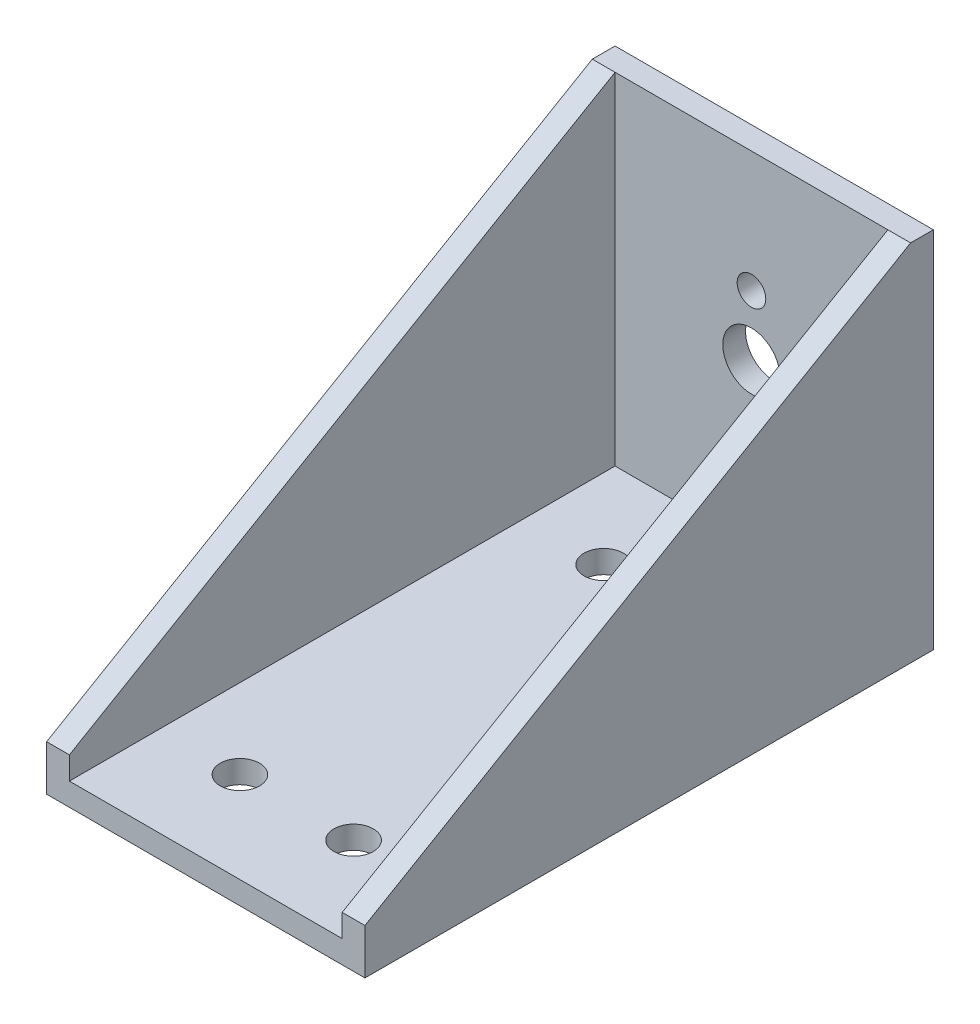
ISO-10303-21;
HEADER;
FILE_DESCRIPTION(('STEP AP214'),'2;1');
FILE_NAME('part.step','',(''),(''),'','','');
FILE_SCHEMA(('AUTOMOTIVE_DESIGN { 1 0 10303 214 1 1 1 1 }'));
ENDSEC;
DATA;
#1=APPLICATION_CONTEXT('core data for automotive mechanical design processes');
#2=APPLICATION_PROTOCOL_DEFINITION('international standard','automotive_design',2000,#1);
#3=PRODUCT_CONTEXT('',#1,'mechanical');
#4=PRODUCT('Part','Part','',(#3));
#5=PRODUCT_RELATED_PRODUCT_CATEGORY('part','',(#4));
#6=PRODUCT_DEFINITION_FORMATION('','',#4);
#7=PRODUCT_DEFINITION_CONTEXT('part definition',#1,'design');
#8=PRODUCT_DEFINITION('design','',#6,#7);
#9=PRODUCT_DEFINITION_SHAPE('','',#8);
#10=(LENGTH_UNIT() NAMED_UNIT(*) SI_UNIT(.MILLI.,.METRE.));
#11=(NAMED_UNIT(*) PLANE_ANGLE_UNIT() SI_UNIT($,.RADIAN.));
#12=(NAMED_UNIT(*) SI_UNIT($,.STERADIAN.) SOLID_ANGLE_UNIT());
#13=UNCERTAINTY_MEASURE_WITH_UNIT(LENGTH_MEASURE(1.E-05),#10,'distance_accuracy_value','');
#14=(GEOMETRIC_REPRESENTATION_CONTEXT(3) GLOBAL_UNCERTAINTY_ASSIGNED_CONTEXT((#13)) GLOBAL_UNIT_ASSIGNED_CONTEXT((#10,
#11,#12)) REPRESENTATION_CONTEXT('',''));
#15=CARTESIAN_POINT('',(0.,0.,0.));
#16=DIRECTION('',(0.,0.,1.));
#17=DIRECTION('',(1.,0.,0.));
#18=AXIS2_PLACEMENT_3D('',#15,#16,#17);
#19=CARTESIAN_POINT('',(0.,0.,3.175));
#20=DIRECTION('',(0.,0.,-1.));
#21=DIRECTION('',(-1.,0.,0.));
#22=AXIS2_PLACEMENT_3D('',#19,#20,#21);
#23=PLANE('',#22);
#24=CARTESIAN_POINT('',(0.,0.,3.175));
#25=DIRECTION('',(0.,0.,1.));
#26=DIRECTION('',(1.,0.,0.));
#27=AXIS2_PLACEMENT_3D('',#24,#25,#26);
#28=CIRCLE('',#27,4.);
#29=CARTESIAN_POINT('',(4.,0.,3.175));
#30=VERTEX_POINT('',#29);
#31=EDGE_CURVE('E210',#30,#30,#28,.T.);
#32=ORIENTED_EDGE('',*,*,#31,.F.);
#33=EDGE_LOOP('',(#32));
#34=FACE_BOUND('',#33,.T.);
#35=CARTESIAN_POINT('',(0.,-8.5,3.175));
#36=DIRECTION('',(0.,0.,1.));
#37=DIRECTION('',(-1.,0.,0.));
#38=AXIS2_PLACEMENT_3D('',#35,#36,#37);
#39=CIRCLE('',#38,2.);
#40=CARTESIAN_POINT('',(-2.,-8.5,3.175));
#41=VERTEX_POINT('',#40);
#42=EDGE_CURVE('E218',#41,#41,#39,.T.);
#43=ORIENTED_EDGE('',*,*,#42,.F.);
#44=EDGE_LOOP('',(#43));
#45=FACE_BOUND('',#44,.T.);
#46=CARTESIAN_POINT('',(0.,8.5,3.175));
#47=DIRECTION('',(0.,0.,1.));
#48=DIRECTION('',(1.,0.,0.));
#49=AXIS2_PLACEMENT_3D('',#46,#47,#48);
#50=CIRCLE('',#49,2.);
#51=CARTESIAN_POINT('',(2.,8.5,3.175));
#52=VERTEX_POINT('',#51);
#53=EDGE_CURVE('E226',#52,#52,#50,.T.);
#54=ORIENTED_EDGE('',*,*,#53,.F.);
#55=EDGE_LOOP('',(#54));
#56=FACE_BOUND('',#55,.T.);
#57=DIRECTION('',(0.,-1.,0.));
#58=VECTOR('',#57,1.);
#59=CARTESIAN_POINT('',(19.05,25.4,3.17499999999999));
#60=LINE('',#59,#58);
#61=CARTESIAN_POINT('',(19.05,25.4,3.17499999999999));
#62=VERTEX_POINT('',#61);
#63=CARTESIAN_POINT('',(19.05,-22.225,3.17499999999999));
#64=VERTEX_POINT('',#63);
#65=EDGE_CURVE('E115',#62,#64,#60,.T.);
#66=ORIENTED_EDGE('',*,*,#65,.F.);
#67=DIRECTION('',(-1.,0.,0.));
#68=VECTOR('',#67,1.);
#69=CARTESIAN_POINT('',(-22.225,25.4,3.175));
#70=LINE('',#69,#68);
#71=CARTESIAN_POINT('',(-19.05,25.4,3.175));
#72=VERTEX_POINT('',#71);
#73=EDGE_CURVE('E125',#62,#72,#70,.T.);
#74=ORIENTED_EDGE('',*,*,#73,.T.);
#75=DIRECTION('',(0.,-1.,0.));
#76=VECTOR('',#75,1.);
#77=CARTESIAN_POINT('',(-19.05,25.4,3.175));
#78=LINE('',#77,#76);
#79=CARTESIAN_POINT('',(-19.05,-22.225,3.175));
#80=VERTEX_POINT('',#79);
#81=EDGE_CURVE('E185',#72,#80,#78,.T.);
#82=ORIENTED_EDGE('',*,*,#81,.T.);
#83=DIRECTION('',(-1.,0.,0.));
#84=VECTOR('',#83,1.);
#85=CARTESIAN_POINT('',(-22.225,-22.225,3.175));
#86=LINE('',#85,#84);
#87=EDGE_CURVE('E127',#64,#80,#86,.T.);
#88=ORIENTED_EDGE('',*,*,#87,.F.);
#89=EDGE_LOOP('',(#66,#74,#82,#88));
#90=FACE_BOUND('',#89,.T.);
#91=ADVANCED_FACE('F41',(#34,#45,#56,#90),#23,.F.);
#92=CARTESIAN_POINT('',(-22.225,-22.225,79.375));
#93=DIRECTION('',(0.,-1.,0.));
#94=DIRECTION('',(0.,0.,-1.));
#95=AXIS2_PLACEMENT_3D('',#92,#93,#94);
#96=PLANE('',#95);
#97=CARTESIAN_POINT('',(-7.9375,-22.225,66.675));
#98=DIRECTION('',(0.,1.,0.));
#99=DIRECTION('',(0.,0.,1.));
#100=AXIS2_PLACEMENT_3D('',#97,#98,#99);
#101=CIRCLE('',#100,2.75);
#102=CARTESIAN_POINT('',(-7.9375,-22.225,69.425));
#103=VERTEX_POINT('',#102);
#104=EDGE_CURVE('E462',#103,#103,#101,.T.);
#105=ORIENTED_EDGE('',*,*,#104,.F.);
#106=EDGE_LOOP('',(#105));
#107=FACE_BOUND('',#106,.T.);
#108=CARTESIAN_POINT('',(7.9375,-22.225,66.675));
#109=DIRECTION('',(0.,1.,0.));
#110=DIRECTION('',(0.,0.,1.));
#111=AXIS2_PLACEMENT_3D('',#108,#109,#110);
#112=CIRCLE('',#111,2.75);
#113=CARTESIAN_POINT('',(7.9375,-22.225,69.425));
#114=VERTEX_POINT('',#113);
#115=EDGE_CURVE('E466',#114,#114,#112,.T.);
#116=ORIENTED_EDGE('',*,*,#115,.F.);
#117=EDGE_LOOP('',(#116));
#118=FACE_BOUND('',#117,.T.);
#119=CARTESIAN_POINT('',(7.9375,-22.225,15.875));
#120=DIRECTION('',(0.,1.,0.));
#121=DIRECTION('',(0.,0.,1.));
#122=AXIS2_PLACEMENT_3D('',#119,#120,#121);
#123=CIRCLE('',#122,2.75);
#124=CARTESIAN_POINT('',(7.9375,-22.225,18.625));
#125=VERTEX_POINT('',#124);
#126=EDGE_CURVE('E488',#125,#125,#123,.T.);
#127=ORIENTED_EDGE('',*,*,#126,.F.);
#128=EDGE_LOOP('',(#127));
#129=FACE_BOUND('',#128,.T.);
#130=CARTESIAN_POINT('',(-7.9375,-22.225,15.875));
#131=DIRECTION('',(0.,1.,0.));
#132=DIRECTION('',(0.,0.,1.));
#133=AXIS2_PLACEMENT_3D('',#130,#131,#132);
#134=CIRCLE('',#133,2.75);
#135=CARTESIAN_POINT('',(-7.9375,-22.225,18.625));
#136=VERTEX_POINT('',#135);
#137=EDGE_CURVE('E475',#136,#136,#134,.T.);
#138=ORIENTED_EDGE('',*,*,#137,.F.);
#139=EDGE_LOOP('',(#138));
#140=FACE_BOUND('',#139,.T.);
#141=DIRECTION('',(0.,0.,1.));
#142=VECTOR('',#141,1.);
#143=CARTESIAN_POINT('',(19.05,-22.225,3.17499999999999));
#144=LINE('',#143,#142);
#145=CARTESIAN_POINT('',(19.05,-22.225,79.375));
#146=VERTEX_POINT('',#145);
#147=EDGE_CURVE('E474',#64,#146,#144,.T.);
#148=ORIENTED_EDGE('',*,*,#147,.F.);
#149=ORIENTED_EDGE('',*,*,#87,.T.);
#150=DIRECTION('',(0.,0.,-1.));
#151=VECTOR('',#150,1.);
#152=CARTESIAN_POINT('',(-19.05,-22.225,3.175));
#153=LINE('',#152,#151);
#154=CARTESIAN_POINT('',(-19.05,-22.225,79.375));
#155=VERTEX_POINT('',#154);
#156=EDGE_CURVE('E129',#155,#80,#153,.T.);
#157=ORIENTED_EDGE('',*,*,#156,.F.);
#158=DIRECTION('',(-1.,0.,0.));
#159=VECTOR('',#158,1.);
#160=CARTESIAN_POINT('',(-22.225,-22.225,79.375));
#161=LINE('',#160,#159);
#162=EDGE_CURVE('E188',#146,#155,#161,.T.);
#163=ORIENTED_EDGE('',*,*,#162,.F.);
#164=EDGE_LOOP('',(#148,#149,#157,#163));
#165=FACE_BOUND('',#164,.T.);
#166=ADVANCED_FACE('F265',(#107,#118,#129,#140,#165),#96,.F.);
#167=CARTESIAN_POINT('',(0.,0.,0.));
#168=DIRECTION('',(0.,0.,-1.));
#169=DIRECTION('',(-1.,0.,0.));
#170=AXIS2_PLACEMENT_3D('',#167,#168,#169);
#171=PLANE('',#170);
#172=CARTESIAN_POINT('',(0.,-8.5,0.));
#173=DIRECTION('',(0.,0.,1.));
#174=DIRECTION('',(-1.,0.,0.));
#175=AXIS2_PLACEMENT_3D('',#172,#173,#174);
#176=CIRCLE('',#175,2.);
#177=CARTESIAN_POINT('',(-2.,-8.5,0.));
#178=VERTEX_POINT('',#177);
#179=EDGE_CURVE('E214',#178,#178,#176,.T.);
#180=ORIENTED_EDGE('',*,*,#179,.T.);
#181=EDGE_LOOP('',(#180));
#182=FACE_BOUND('',#181,.T.);
#183=DIRECTION('',(0.,1.,0.));
#184=VECTOR('',#183,1.);
#185=CARTESIAN_POINT('',(22.225,-25.4,0.));
#186=LINE('',#185,#184);
#187=CARTESIAN_POINT('',(22.225,-25.4,0.));
#188=VERTEX_POINT('',#187);
#189=CARTESIAN_POINT('',(22.225,25.4,0.));
#190=VERTEX_POINT('',#189);
#191=EDGE_CURVE('E230',#188,#190,#186,.T.);
#192=ORIENTED_EDGE('',*,*,#191,.F.);
#193=DIRECTION('',(1.,0.,0.));
#194=VECTOR('',#193,1.);
#195=CARTESIAN_POINT('',(-22.225,-25.4,0.));
#196=LINE('',#195,#194);
#197=CARTESIAN_POINT('',(-22.225,-25.4,0.));
#198=VERTEX_POINT('',#197);
#199=EDGE_CURVE('E141',#198,#188,#196,.T.);
#200=ORIENTED_EDGE('',*,*,#199,.F.);
#201=DIRECTION('',(0.,-1.,0.));
#202=VECTOR('',#201,1.);
#203=CARTESIAN_POINT('',(-22.225,-25.4,0.));
#204=LINE('',#203,#202);
#205=CARTESIAN_POINT('',(-22.225,25.4,0.));
#206=VERTEX_POINT('',#205);
#207=EDGE_CURVE('E239',#206,#198,#204,.T.);
#208=ORIENTED_EDGE('',*,*,#207,.F.);
#209=DIRECTION('',(-1.,0.,0.));
#210=VECTOR('',#209,1.);
#211=CARTESIAN_POINT('',(-22.225,25.4,0.));
#212=LINE('',#211,#210);
#213=EDGE_CURVE('E174',#190,#206,#212,.T.);
#214=ORIENTED_EDGE('',*,*,#213,.F.);
#215=EDGE_LOOP('',(#192,#200,#208,#214));
#216=FACE_BOUND('',#215,.T.);
#217=CARTESIAN_POINT('',(0.,8.5,0.));
#218=DIRECTION('',(0.,0.,1.));
#219=DIRECTION('',(1.,0.,0.));
#220=AXIS2_PLACEMENT_3D('',#217,#218,#219);
#221=CIRCLE('',#220,2.);
#222=CARTESIAN_POINT('',(2.,8.5,0.));
#223=VERTEX_POINT('',#222);
#224=EDGE_CURVE('E222',#223,#223,#221,.T.);
#225=ORIENTED_EDGE('',*,*,#224,.T.);
#226=EDGE_LOOP('',(#225));
#227=FACE_BOUND('',#226,.T.);
#228=CARTESIAN_POINT('',(0.,0.,0.));
#229=DIRECTION('',(0.,0.,1.));
#230=DIRECTION('',(1.,0.,0.));
#231=AXIS2_PLACEMENT_3D('',#228,#229,#230);
#232=CIRCLE('',#231,4.);
#233=CARTESIAN_POINT('',(4.,0.,0.));
#234=VERTEX_POINT('',#233);
#235=EDGE_CURVE('E208',#234,#234,#232,.T.);
#236=ORIENTED_EDGE('',*,*,#235,.T.);
#237=EDGE_LOOP('',(#236));
#238=FACE_BOUND('',#237,.T.);
#239=ADVANCED_FACE('F255',(#182,#216,#227,#238),#171,.T.);
#240=CARTESIAN_POINT('',(22.225,-25.4,3.175));
#241=DIRECTION('',(-1.,0.,0.));
#242=DIRECTION('',(0.,0.,1.));
#243=AXIS2_PLACEMENT_3D('',#240,#241,#242);
#244=PLANE('',#243);
#245=DIRECTION('',(0.,0.,-1.));
#246=VECTOR('',#245,1.);
#247=CARTESIAN_POINT('',(22.225,25.4,3.175));
#248=LINE('',#247,#246);
#249=CARTESIAN_POINT('',(22.225,25.4,3.175));
#250=VERTEX_POINT('',#249);
#251=EDGE_CURVE('E144',#250,#190,#248,.T.);
#252=ORIENTED_EDGE('',*,*,#251,.F.);
#253=DIRECTION('',(0.,0.503871025524087,-0.863778900898433));
#254=VECTOR('',#253,1.);
#255=CARTESIAN_POINT('',(22.225,25.4,3.175));
#256=LINE('',#255,#254);
#257=CARTESIAN_POINT('',(22.225,-19.0500000000001,79.375));
#258=VERTEX_POINT('',#257);
#259=EDGE_CURVE('E51',#250,#258,#256,.F.);
#260=ORIENTED_EDGE('',*,*,#259,.T.);
#261=DIRECTION('',(0.,1.,0.));
#262=VECTOR('',#261,1.);
#263=CARTESIAN_POINT('',(22.225,-25.4,79.375));
#264=LINE('',#263,#262);
#265=CARTESIAN_POINT('',(22.225,-25.4,79.375));
#266=VERTEX_POINT('',#265);
#267=EDGE_CURVE('E204',#266,#258,#264,.T.);
#268=ORIENTED_EDGE('',*,*,#267,.F.);
#269=DIRECTION('',(0.,0.,-1.));
#270=VECTOR('',#269,1.);
#271=CARTESIAN_POINT('',(22.225,-25.4,3.175));
#272=LINE('',#271,#270);
#273=EDGE_CURVE('E140',#266,#188,#272,.T.);
#274=ORIENTED_EDGE('',*,*,#273,.T.);
#275=ORIENTED_EDGE('',*,*,#191,.T.);
#276=EDGE_LOOP('',(#252,#260,#268,#274,#275));
#277=FACE_BOUND('',#276,.T.);
#278=ADVANCED_FACE('F257',(#277),#244,.F.);
#279=CARTESIAN_POINT('',(-22.225,25.4,3.175));
#280=DIRECTION('',(0.,-1.,0.));
#281=DIRECTION('',(0.,0.,-1.));
#282=AXIS2_PLACEMENT_3D('',#279,#280,#281);
#283=PLANE('',#282);
#284=DIRECTION('',(0.,0.,-1.));
#285=VECTOR('',#284,1.);
#286=CARTESIAN_POINT('',(-22.225,25.4,3.175));
#287=LINE('',#286,#285);
#288=CARTESIAN_POINT('',(-22.225,25.4,3.175));
#289=VERTEX_POINT('',#288);
#290=EDGE_CURVE('E150',#289,#206,#287,.T.);
#291=ORIENTED_EDGE('',*,*,#290,.F.);
#292=DIRECTION('',(1.,0.,0.));
#293=VECTOR('',#292,1.);
#294=CARTESIAN_POINT('',(-22.225,25.4,3.175));
#295=LINE('',#294,#293);
#296=EDGE_CURVE('E138',#289,#72,#295,.T.);
#297=ORIENTED_EDGE('',*,*,#296,.T.);
#298=ORIENTED_EDGE('',*,*,#73,.F.);
#299=DIRECTION('',(1.,0.,0.));
#300=VECTOR('',#299,1.);
#301=CARTESIAN_POINT('',(-22.225,25.4,3.175));
#302=LINE('',#301,#300);
#303=EDGE_CURVE('E136',#62,#250,#302,.T.);
#304=ORIENTED_EDGE('',*,*,#303,.T.);
#305=ORIENTED_EDGE('',*,*,#251,.T.);
#306=ORIENTED_EDGE('',*,*,#213,.T.);
#307=EDGE_LOOP('',(#291,#297,#298,#304,#305,#306));
#308=FACE_BOUND('',#307,.T.);
#309=ADVANCED_FACE('F135',(#308),#283,.F.);
#310=CARTESIAN_POINT('',(-22.225,-25.4,3.175));
#311=DIRECTION('',(1.,0.,0.));
#312=DIRECTION('',(0.,0.,-1.));
#313=AXIS2_PLACEMENT_3D('',#310,#311,#312);
#314=PLANE('',#313);
#315=DIRECTION('',(0.,-1.,0.));
#316=VECTOR('',#315,1.);
#317=CARTESIAN_POINT('',(-22.225,-25.4,79.375));
#318=LINE('',#317,#316);
#319=CARTESIAN_POINT('',(-22.225,-19.0500000000001,79.375));
#320=VERTEX_POINT('',#319);
#321=CARTESIAN_POINT('',(-22.225,-25.4,79.375));
#322=VERTEX_POINT('',#321);
#323=EDGE_CURVE('E170',#320,#322,#318,.T.);
#324=ORIENTED_EDGE('',*,*,#323,.F.);
#325=DIRECTION('',(0.,-0.503871025524087,0.863778900898433));
#326=VECTOR('',#325,1.);
#327=CARTESIAN_POINT('',(-22.225,25.4,3.175));
#328=LINE('',#327,#326);
#329=EDGE_CURVE('E161',#320,#289,#328,.F.);
#330=ORIENTED_EDGE('',*,*,#329,.T.);
#331=ORIENTED_EDGE('',*,*,#290,.T.);
#332=ORIENTED_EDGE('',*,*,#207,.T.);
#333=DIRECTION('',(0.,0.,-1.));
#334=VECTOR('',#333,1.);
#335=CARTESIAN_POINT('',(-22.225,-25.4,3.175));
#336=LINE('',#335,#334);
#337=EDGE_CURVE('E177',#322,#198,#336,.T.);
#338=ORIENTED_EDGE('',*,*,#337,.F.);
#339=EDGE_LOOP('',(#324,#330,#331,#332,#338));
#340=FACE_BOUND('',#339,.T.);
#341=ADVANCED_FACE('F167',(#340),#314,.F.);
#342=CARTESIAN_POINT('',(-22.225,-25.4,3.175));
#343=DIRECTION('',(0.,1.,0.));
#344=DIRECTION('',(0.,0.,1.));
#345=AXIS2_PLACEMENT_3D('',#342,#343,#344);
#346=PLANE('',#345);
#347=CARTESIAN_POINT('',(-7.9375,-25.4,66.675));
#348=DIRECTION('',(0.,1.,0.));
#349=DIRECTION('',(0.,0.,1.));
#350=AXIS2_PLACEMENT_3D('',#347,#348,#349);
#351=CIRCLE('',#350,2.75);
#352=CARTESIAN_POINT('',(-7.9375,-25.4,69.425));
#353=VERTEX_POINT('',#352);
#354=EDGE_CURVE('E459',#353,#353,#351,.T.);
#355=ORIENTED_EDGE('',*,*,#354,.T.);
#356=EDGE_LOOP('',(#355));
#357=FACE_BOUND('',#356,.T.);
#358=CARTESIAN_POINT('',(7.9375,-25.4,66.675));
#359=DIRECTION('',(0.,1.,0.));
#360=DIRECTION('',(0.,0.,1.));
#361=AXIS2_PLACEMENT_3D('',#358,#359,#360);
#362=CIRCLE('',#361,2.75);
#363=CARTESIAN_POINT('',(7.9375,-25.4,69.425));
#364=VERTEX_POINT('',#363);
#365=EDGE_CURVE('E492',#364,#364,#362,.T.);
#366=ORIENTED_EDGE('',*,*,#365,.T.);
#367=EDGE_LOOP('',(#366));
#368=FACE_BOUND('',#367,.T.);
#369=CARTESIAN_POINT('',(7.9375,-25.4,15.875));
#370=DIRECTION('',(0.,1.,0.));
#371=DIRECTION('',(0.,0.,1.));
#372=AXIS2_PLACEMENT_3D('',#369,#370,#371);
#373=CIRCLE('',#372,2.75);
#374=CARTESIAN_POINT('',(7.9375,-25.4,18.625));
#375=VERTEX_POINT('',#374);
#376=EDGE_CURVE('E479',#375,#375,#373,.T.);
#377=ORIENTED_EDGE('',*,*,#376,.T.);
#378=EDGE_LOOP('',(#377));
#379=FACE_BOUND('',#378,.T.);
#380=CARTESIAN_POINT('',(-7.9375,-25.4,15.875));
#381=DIRECTION('',(0.,1.,0.));
#382=DIRECTION('',(0.,0.,1.));
#383=AXIS2_PLACEMENT_3D('',#380,#381,#382);
#384=CIRCLE('',#383,2.75);
#385=CARTESIAN_POINT('',(-7.9375,-25.4,18.625));
#386=VERTEX_POINT('',#385);
#387=EDGE_CURVE('E470',#386,#386,#384,.T.);
#388=ORIENTED_EDGE('',*,*,#387,.T.);
#389=EDGE_LOOP('',(#388));
#390=FACE_BOUND('',#389,.T.);
#391=ORIENTED_EDGE('',*,*,#199,.T.);
#392=ORIENTED_EDGE('',*,*,#273,.F.);
#393=DIRECTION('',(1.,0.,0.));
#394=VECTOR('',#393,1.);
#395=CARTESIAN_POINT('',(-22.225,-25.4,79.375));
#396=LINE('',#395,#394);
#397=EDGE_CURVE('E200',#322,#266,#396,.T.);
#398=ORIENTED_EDGE('',*,*,#397,.F.);
#399=ORIENTED_EDGE('',*,*,#337,.T.);
#400=EDGE_LOOP('',(#391,#392,#398,#399));
#401=FACE_BOUND('',#400,.T.);
#402=ADVANCED_FACE('F252',(#357,#368,#379,#390,#401),#346,.F.);
#403=CARTESIAN_POINT('',(0.,8.5,3.175));
#404=DIRECTION('',(0.,0.,-1.));
#405=DIRECTION('',(-1.,0.,0.));
#406=AXIS2_PLACEMENT_3D('',#403,#404,#405);
#407=CYLINDRICAL_SURFACE('',#406,2.);
#408=ORIENTED_EDGE('',*,*,#53,.T.);
#409=EDGE_LOOP('',(#408));
#410=FACE_BOUND('',#409,.T.);
#411=ORIENTED_EDGE('',*,*,#224,.F.);
#412=EDGE_LOOP('',(#411));
#413=FACE_BOUND('',#412,.T.);
#414=ADVANCED_FACE('F279',(#410,#413),#407,.F.);
#415=CARTESIAN_POINT('',(0.,-8.5,3.175));
#416=DIRECTION('',(0.,0.,-1.));
#417=DIRECTION('',(-1.,0.,0.));
#418=AXIS2_PLACEMENT_3D('',#415,#416,#417);
#419=CYLINDRICAL_SURFACE('',#418,2.);
#420=ORIENTED_EDGE('',*,*,#42,.T.);
#421=EDGE_LOOP('',(#420));
#422=FACE_BOUND('',#421,.T.);
#423=ORIENTED_EDGE('',*,*,#179,.F.);
#424=EDGE_LOOP('',(#423));
#425=FACE_BOUND('',#424,.T.);
#426=ADVANCED_FACE('F303',(#422,#425),#419,.F.);
#427=CARTESIAN_POINT('',(0.,0.,3.175));
#428=DIRECTION('',(0.,0.,-1.));
#429=DIRECTION('',(-1.,0.,0.));
#430=AXIS2_PLACEMENT_3D('',#427,#428,#429);
#431=CYLINDRICAL_SURFACE('',#430,4.);
#432=ORIENTED_EDGE('',*,*,#31,.T.);
#433=EDGE_LOOP('',(#432));
#434=FACE_BOUND('',#433,.T.);
#435=ORIENTED_EDGE('',*,*,#235,.F.);
#436=EDGE_LOOP('',(#435));
#437=FACE_BOUND('',#436,.T.);
#438=ADVANCED_FACE('F311',(#434,#437),#431,.F.);
#439=CARTESIAN_POINT('',(0.,0.,79.375));
#440=DIRECTION('',(0.,0.,-1.));
#441=DIRECTION('',(-1.,0.,0.));
#442=AXIS2_PLACEMENT_3D('',#439,#440,#441);
#443=PLANE('',#442);
#444=DIRECTION('',(0.,-1.,0.));
#445=VECTOR('',#444,1.);
#446=CARTESIAN_POINT('',(-19.05,25.4,79.375));
#447=LINE('',#446,#445);
#448=CARTESIAN_POINT('',(-19.05,-19.0500000000001,79.375));
#449=VERTEX_POINT('',#448);
#450=EDGE_CURVE('E183',#449,#155,#447,.T.);
#451=ORIENTED_EDGE('',*,*,#450,.F.);
#452=DIRECTION('',(-1.,0.,0.));
#453=VECTOR('',#452,1.);
#454=CARTESIAN_POINT('',(0.,-19.0500000000001,79.375));
#455=LINE('',#454,#453);
#456=EDGE_CURVE('E158',#449,#320,#455,.T.);
#457=ORIENTED_EDGE('',*,*,#456,.T.);
#458=ORIENTED_EDGE('',*,*,#323,.T.);
#459=ORIENTED_EDGE('',*,*,#397,.T.);
#460=ORIENTED_EDGE('',*,*,#267,.T.);
#461=DIRECTION('',(-1.,0.,0.));
#462=VECTOR('',#461,1.);
#463=CARTESIAN_POINT('',(0.,-19.0500000000001,79.375));
#464=LINE('',#463,#462);
#465=CARTESIAN_POINT('',(19.05,-19.0500000000001,79.375));
#466=VERTEX_POINT('',#465);
#467=EDGE_CURVE('E58',#258,#466,#464,.T.);
#468=ORIENTED_EDGE('',*,*,#467,.T.);
#469=DIRECTION('',(0.,-1.,0.));
#470=VECTOR('',#469,1.);
#471=CARTESIAN_POINT('',(19.05,25.4,79.375));
#472=LINE('',#471,#470);
#473=EDGE_CURVE('E117',#466,#146,#472,.T.);
#474=ORIENTED_EDGE('',*,*,#473,.T.);
#475=ORIENTED_EDGE('',*,*,#162,.T.);
#476=EDGE_LOOP('',(#451,#457,#458,#459,#460,#468,#474,#475));
#477=FACE_BOUND('',#476,.T.);
#478=ADVANCED_FACE('F186',(#477),#443,.F.);
#479=CARTESIAN_POINT('',(-19.05,25.4,3.175));
#480=DIRECTION('',(-1.,0.,0.));
#481=DIRECTION('',(0.,0.,1.));
#482=AXIS2_PLACEMENT_3D('',#479,#480,#481);
#483=PLANE('',#482);
#484=ORIENTED_EDGE('',*,*,#81,.F.);
#485=DIRECTION('',(0.,0.503871025524087,-0.863778900898433));
#486=VECTOR('',#485,1.);
#487=CARTESIAN_POINT('',(-19.05,25.4,3.175));
#488=LINE('',#487,#486);
#489=EDGE_CURVE('E148',#72,#449,#488,.F.);
#490=ORIENTED_EDGE('',*,*,#489,.T.);
#491=ORIENTED_EDGE('',*,*,#450,.T.);
#492=ORIENTED_EDGE('',*,*,#156,.T.);
#493=EDGE_LOOP('',(#484,#490,#491,#492));
#494=FACE_BOUND('',#493,.T.);
#495=ADVANCED_FACE('F181',(#494),#483,.F.);
#496=CARTESIAN_POINT('',(19.05,25.4,3.17499999999999));
#497=DIRECTION('',(1.,0.,0.));
#498=DIRECTION('',(0.,0.,-1.));
#499=AXIS2_PLACEMENT_3D('',#496,#497,#498);
#500=PLANE('',#499);
#501=ORIENTED_EDGE('',*,*,#473,.F.);
#502=DIRECTION('',(0.,-0.503871025524087,0.863778900898433));
#503=VECTOR('',#502,1.);
#504=CARTESIAN_POINT('',(19.05,25.4,3.175));
#505=LINE('',#504,#503);
#506=EDGE_CURVE('E11',#466,#62,#505,.F.);
#507=ORIENTED_EDGE('',*,*,#506,.T.);
#508=ORIENTED_EDGE('',*,*,#65,.T.);
#509=ORIENTED_EDGE('',*,*,#147,.T.);
#510=EDGE_LOOP('',(#501,#507,#508,#509));
#511=FACE_BOUND('',#510,.T.);
#512=ADVANCED_FACE('F113',(#511),#500,.F.);
#513=CARTESIAN_POINT('',(-22.225,25.4,3.175));
#514=DIRECTION('',(0.,-0.863778900898433,-0.503871025524087));
#515=DIRECTION('',(1.,0.,0.));
#516=AXIS2_PLACEMENT_3D('',#513,#514,#515);
#517=PLANE('',#516);
#518=ORIENTED_EDGE('',*,*,#329,.F.);
#519=ORIENTED_EDGE('',*,*,#456,.F.);
#520=ORIENTED_EDGE('',*,*,#489,.F.);
#521=ORIENTED_EDGE('',*,*,#296,.F.);
#522=EDGE_LOOP('',(#518,#519,#520,#521));
#523=FACE_BOUND('',#522,.T.);
#524=ADVANCED_FACE('F178',(#523),#517,.F.);
#525=CARTESIAN_POINT('',(-22.225,25.4,3.175));
#526=DIRECTION('',(0.,-0.863778900898433,-0.503871025524087));
#527=DIRECTION('',(1.,0.,0.));
#528=AXIS2_PLACEMENT_3D('',#525,#526,#527);
#529=PLANE('',#528);
#530=ORIENTED_EDGE('',*,*,#506,.F.);
#531=ORIENTED_EDGE('',*,*,#467,.F.);
#532=ORIENTED_EDGE('',*,*,#259,.F.);
#533=ORIENTED_EDGE('',*,*,#303,.F.);
#534=EDGE_LOOP('',(#530,#531,#532,#533));
#535=FACE_BOUND('',#534,.T.);
#536=ADVANCED_FACE('F44',(#535),#529,.F.);
#537=CARTESIAN_POINT('',(-7.9375,-25.4,15.875));
#538=DIRECTION('',(0.,1.,0.));
#539=DIRECTION('',(0.,0.,1.));
#540=AXIS2_PLACEMENT_3D('',#537,#538,#539);
#541=CYLINDRICAL_SURFACE('',#540,2.75);
#542=ORIENTED_EDGE('',*,*,#387,.F.);
#543=EDGE_LOOP('',(#542));
#544=FACE_BOUND('',#543,.T.);
#545=ORIENTED_EDGE('',*,*,#137,.T.);
#546=EDGE_LOOP('',(#545));
#547=FACE_BOUND('',#546,.T.);
#548=ADVANCED_FACE('F347',(#544,#547),#541,.F.);
#549=CARTESIAN_POINT('',(7.9375,-25.4,15.875));
#550=DIRECTION('',(0.,1.,0.));
#551=DIRECTION('',(0.,0.,1.));
#552=AXIS2_PLACEMENT_3D('',#549,#550,#551);
#553=CYLINDRICAL_SURFACE('',#552,2.75);
#554=ORIENTED_EDGE('',*,*,#376,.F.);
#555=EDGE_LOOP('',(#554));
#556=FACE_BOUND('',#555,.T.);
#557=ORIENTED_EDGE('',*,*,#126,.T.);
#558=EDGE_LOOP('',(#557));
#559=FACE_BOUND('',#558,.T.);
#560=ADVANCED_FACE('F352',(#556,#559),#553,.F.);
#561=CARTESIAN_POINT('',(7.9375,-25.4,66.675));
#562=DIRECTION('',(0.,1.,0.));
#563=DIRECTION('',(0.,0.,1.));
#564=AXIS2_PLACEMENT_3D('',#561,#562,#563);
#565=CYLINDRICAL_SURFACE('',#564,2.75);
#566=ORIENTED_EDGE('',*,*,#365,.F.);
#567=EDGE_LOOP('',(#566));
#568=FACE_BOUND('',#567,.T.);
#569=ORIENTED_EDGE('',*,*,#115,.T.);
#570=EDGE_LOOP('',(#569));
#571=FACE_BOUND('',#570,.T.);
#572=ADVANCED_FACE('F360',(#568,#571),#565,.F.);
#573=CARTESIAN_POINT('',(-7.9375,-25.4,66.675));
#574=DIRECTION('',(0.,1.,0.));
#575=DIRECTION('',(0.,0.,1.));
#576=AXIS2_PLACEMENT_3D('',#573,#574,#575);
#577=CYLINDRICAL_SURFACE('',#576,2.75);
#578=ORIENTED_EDGE('',*,*,#354,.F.);
#579=EDGE_LOOP('',(#578));
#580=FACE_BOUND('',#579,.T.);
#581=ORIENTED_EDGE('',*,*,#104,.T.);
#582=EDGE_LOOP('',(#581));
#583=FACE_BOUND('',#582,.T.);
#584=ADVANCED_FACE('F368',(#580,#583),#577,.F.);
#585=CLOSED_SHELL('',(#91,#166,#239,#278,#309,#341,#402,#414,#426,#438,#478,#495,#512,#524,#536,
#548,#560,#572,#584));
#586=MANIFOLD_SOLID_BREP('B2',#585);
#587=ADVANCED_BREP_SHAPE_REPRESENTATION('',(#18,#586),#14);
#588=SHAPE_DEFINITION_REPRESENTATION(#9,#587);
ENDSEC;
END-ISO-10303-21;
